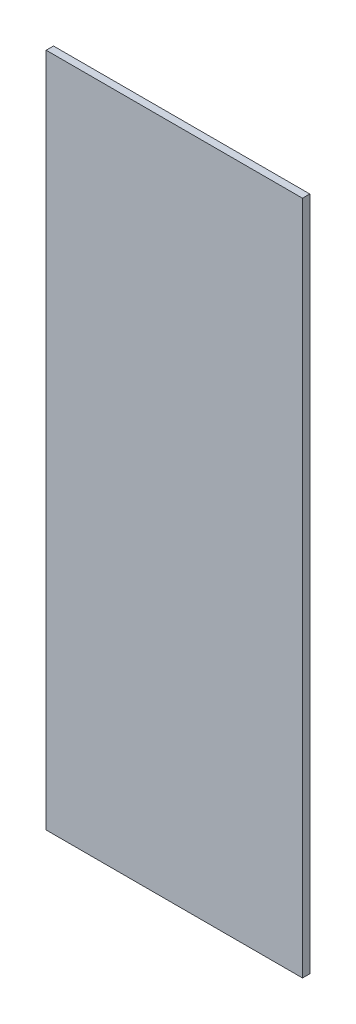
ISO-10303-21;
HEADER;
FILE_DESCRIPTION(('STEP AP214'),'2;1');
FILE_NAME('part.step','',(''),(''),'','','');
FILE_SCHEMA(('AUTOMOTIVE_DESIGN { 1 0 10303 214 1 1 1 1 }'));
ENDSEC;
DATA;
#1=APPLICATION_CONTEXT('core data for automotive mechanical design processes');
#2=APPLICATION_PROTOCOL_DEFINITION('international standard','automotive_design',2000,#1);
#3=PRODUCT_CONTEXT('',#1,'mechanical');
#4=PRODUCT('Part','Part','',(#3));
#5=PRODUCT_RELATED_PRODUCT_CATEGORY('part','',(#4));
#6=PRODUCT_DEFINITION_FORMATION('','',#4);
#7=PRODUCT_DEFINITION_CONTEXT('part definition',#1,'design');
#8=PRODUCT_DEFINITION('design','',#6,#7);
#9=PRODUCT_DEFINITION_SHAPE('','',#8);
#10=(LENGTH_UNIT() NAMED_UNIT(*) SI_UNIT(.MILLI.,.METRE.));
#11=(NAMED_UNIT(*) PLANE_ANGLE_UNIT() SI_UNIT($,.RADIAN.));
#12=(NAMED_UNIT(*) SI_UNIT($,.STERADIAN.) SOLID_ANGLE_UNIT());
#13=UNCERTAINTY_MEASURE_WITH_UNIT(LENGTH_MEASURE(1.E-05),#10,'distance_accuracy_value','');
#14=(GEOMETRIC_REPRESENTATION_CONTEXT(3) GLOBAL_UNCERTAINTY_ASSIGNED_CONTEXT((#13)) GLOBAL_UNIT_ASSIGNED_CONTEXT((#10,
#11,#12)) REPRESENTATION_CONTEXT('',''));
#15=CARTESIAN_POINT('',(0.,0.,0.));
#16=DIRECTION('',(0.,0.,1.));
#17=DIRECTION('',(1.,0.,0.));
#18=AXIS2_PLACEMENT_3D('',#15,#16,#17);
#19=CARTESIAN_POINT('',(-120.805773130679,130.559027400543,1.8));
#20=DIRECTION('',(1.,0.,0.));
#21=DIRECTION('',(0.,1.,0.));
#22=AXIS2_PLACEMENT_3D('',#19,#20,#21);
#23=PLANE('',#22);
#24=DIRECTION('',(0.,-1.,0.));
#25=VECTOR('',#24,1.);
#26=CARTESIAN_POINT('',(-120.805773130679,130.559027400543,0.));
#27=LINE('',#26,#25);
#28=CARTESIAN_POINT('',(-120.805773130679,130.559027400543,0.));
#29=VERTEX_POINT('',#28);
#30=CARTESIAN_POINT('',(-120.805773130679,-35.4409725994567,0.));
#31=VERTEX_POINT('',#30);
#32=EDGE_CURVE('E98',#29,#31,#27,.T.);
#33=ORIENTED_EDGE('',*,*,#32,.T.);
#34=DIRECTION('',(0.,0.,-1.));
#35=VECTOR('',#34,1.);
#36=CARTESIAN_POINT('',(-120.805773130679,-35.4409725994567,1.8));
#37=LINE('',#36,#35);
#38=CARTESIAN_POINT('',(-120.805773130679,-35.4409725994567,1.8));
#39=VERTEX_POINT('',#38);
#40=EDGE_CURVE('E11',#39,#31,#37,.T.);
#41=ORIENTED_EDGE('',*,*,#40,.F.);
#42=DIRECTION('',(0.,-1.,0.));
#43=VECTOR('',#42,1.);
#44=CARTESIAN_POINT('',(-120.805773130679,130.559027400543,1.8));
#45=LINE('',#44,#43);
#46=CARTESIAN_POINT('',(-120.805773130679,130.559027400543,1.8));
#47=VERTEX_POINT('',#46);
#48=EDGE_CURVE('E86',#47,#39,#45,.T.);
#49=ORIENTED_EDGE('',*,*,#48,.F.);
#50=DIRECTION('',(0.,0.,-1.));
#51=VECTOR('',#50,1.);
#52=CARTESIAN_POINT('',(-120.805773130679,130.559027400543,1.8));
#53=LINE('',#52,#51);
#54=EDGE_CURVE('E94',#47,#29,#53,.T.);
#55=ORIENTED_EDGE('',*,*,#54,.T.);
#56=EDGE_LOOP('',(#33,#41,#49,#55));
#57=FACE_BOUND('',#56,.T.);
#58=ADVANCED_FACE('F35',(#57),#23,.F.);
#59=CARTESIAN_POINT('',(-120.805773130679,-35.4409725994567,1.8));
#60=DIRECTION('',(0.,1.,0.));
#61=DIRECTION('',(0.,0.,1.));
#62=AXIS2_PLACEMENT_3D('',#59,#60,#61);
#63=PLANE('',#62);
#64=DIRECTION('',(1.,0.,0.));
#65=VECTOR('',#64,1.);
#66=CARTESIAN_POINT('',(-120.805773130679,-35.4409725994567,0.));
#67=LINE('',#66,#65);
#68=CARTESIAN_POINT('',(-57.8057731306791,-35.4409725994567,0.));
#69=VERTEX_POINT('',#68);
#70=EDGE_CURVE('E90',#31,#69,#67,.T.);
#71=ORIENTED_EDGE('',*,*,#70,.T.);
#72=DIRECTION('',(0.,0.,-1.));
#73=VECTOR('',#72,1.);
#74=CARTESIAN_POINT('',(-57.8057731306791,-35.4409725994567,1.8));
#75=LINE('',#74,#73);
#76=CARTESIAN_POINT('',(-57.8057731306791,-35.4409725994567,1.8));
#77=VERTEX_POINT('',#76);
#78=EDGE_CURVE('E43',#77,#69,#75,.T.);
#79=ORIENTED_EDGE('',*,*,#78,.F.);
#80=DIRECTION('',(1.,0.,0.));
#81=VECTOR('',#80,1.);
#82=CARTESIAN_POINT('',(-120.805773130679,-35.4409725994567,1.8));
#83=LINE('',#82,#81);
#84=EDGE_CURVE('E81',#39,#77,#83,.T.);
#85=ORIENTED_EDGE('',*,*,#84,.F.);
#86=ORIENTED_EDGE('',*,*,#40,.T.);
#87=EDGE_LOOP('',(#71,#79,#85,#86));
#88=FACE_BOUND('',#87,.T.);
#89=ADVANCED_FACE('F89',(#88),#63,.F.);
#90=CARTESIAN_POINT('',(-57.8057731306791,130.559027400543,1.8));
#91=DIRECTION('',(-1.,0.,0.));
#92=DIRECTION('',(0.,-1.,0.));
#93=AXIS2_PLACEMENT_3D('',#90,#91,#92);
#94=PLANE('',#93);
#95=DIRECTION('',(0.,1.,0.));
#96=VECTOR('',#95,1.);
#97=CARTESIAN_POINT('',(-57.8057731306791,130.559027400543,0.));
#98=LINE('',#97,#96);
#99=CARTESIAN_POINT('',(-57.8057731306791,130.559027400543,0.));
#100=VERTEX_POINT('',#99);
#101=EDGE_CURVE('E68',#69,#100,#98,.T.);
#102=ORIENTED_EDGE('',*,*,#101,.T.);
#103=DIRECTION('',(0.,0.,-1.));
#104=VECTOR('',#103,1.);
#105=CARTESIAN_POINT('',(-57.8057731306791,130.559027400543,1.8));
#106=LINE('',#105,#104);
#107=CARTESIAN_POINT('',(-57.8057731306791,130.559027400543,1.8));
#108=VERTEX_POINT('',#107);
#109=EDGE_CURVE('E91',#108,#100,#106,.T.);
#110=ORIENTED_EDGE('',*,*,#109,.F.);
#111=DIRECTION('',(0.,1.,0.));
#112=VECTOR('',#111,1.);
#113=CARTESIAN_POINT('',(-57.8057731306791,130.559027400543,1.8));
#114=LINE('',#113,#112);
#115=EDGE_CURVE('E84',#77,#108,#114,.T.);
#116=ORIENTED_EDGE('',*,*,#115,.F.);
#117=ORIENTED_EDGE('',*,*,#78,.T.);
#118=EDGE_LOOP('',(#102,#110,#116,#117));
#119=FACE_BOUND('',#118,.T.);
#120=ADVANCED_FACE('F92',(#119),#94,.F.);
#121=CARTESIAN_POINT('',(-120.805773130679,130.559027400543,1.8));
#122=DIRECTION('',(0.,-1.,0.));
#123=DIRECTION('',(0.,0.,-1.));
#124=AXIS2_PLACEMENT_3D('',#121,#122,#123);
#125=PLANE('',#124);
#126=DIRECTION('',(-1.,0.,0.));
#127=VECTOR('',#126,1.);
#128=CARTESIAN_POINT('',(-120.805773130679,130.559027400543,0.));
#129=LINE('',#128,#127);
#130=EDGE_CURVE('E74',#100,#29,#129,.T.);
#131=ORIENTED_EDGE('',*,*,#130,.T.);
#132=ORIENTED_EDGE('',*,*,#54,.F.);
#133=DIRECTION('',(-1.,0.,0.));
#134=VECTOR('',#133,1.);
#135=CARTESIAN_POINT('',(-120.805773130679,130.559027400543,1.8));
#136=LINE('',#135,#134);
#137=EDGE_CURVE('E51',#108,#47,#136,.T.);
#138=ORIENTED_EDGE('',*,*,#137,.F.);
#139=ORIENTED_EDGE('',*,*,#109,.T.);
#140=EDGE_LOOP('',(#131,#132,#138,#139));
#141=FACE_BOUND('',#140,.T.);
#142=ADVANCED_FACE('F105',(#141),#125,.F.);
#143=CARTESIAN_POINT('',(0.,0.,1.8));
#144=DIRECTION('',(0.,0.,1.));
#145=DIRECTION('',(1.,0.,0.));
#146=AXIS2_PLACEMENT_3D('',#143,#144,#145);
#147=PLANE('',#146);
#148=ORIENTED_EDGE('',*,*,#48,.T.);
#149=ORIENTED_EDGE('',*,*,#84,.T.);
#150=ORIENTED_EDGE('',*,*,#115,.T.);
#151=ORIENTED_EDGE('',*,*,#137,.T.);
#152=EDGE_LOOP('',(#148,#149,#150,#151));
#153=FACE_BOUND('',#152,.T.);
#154=ADVANCED_FACE('F82',(#153),#147,.T.);
#155=CARTESIAN_POINT('',(0.,0.,0.));
#156=DIRECTION('',(0.,0.,1.));
#157=DIRECTION('',(1.,0.,0.));
#158=AXIS2_PLACEMENT_3D('',#155,#156,#157);
#159=PLANE('',#158);
#160=ORIENTED_EDGE('',*,*,#32,.F.);
#161=ORIENTED_EDGE('',*,*,#130,.F.);
#162=ORIENTED_EDGE('',*,*,#101,.F.);
#163=ORIENTED_EDGE('',*,*,#70,.F.);
#164=EDGE_LOOP('',(#160,#161,#162,#163));
#165=FACE_BOUND('',#164,.T.);
#166=ADVANCED_FACE('F108',(#165),#159,.F.);
#167=CLOSED_SHELL('',(#58,#89,#120,#142,#154,#166));
#168=MANIFOLD_SOLID_BREP('B2',#167);
#169=ADVANCED_BREP_SHAPE_REPRESENTATION('',(#18,#168),#14);
#170=SHAPE_DEFINITION_REPRESENTATION(#9,#169);
ENDSEC;
END-ISO-10303-21;
